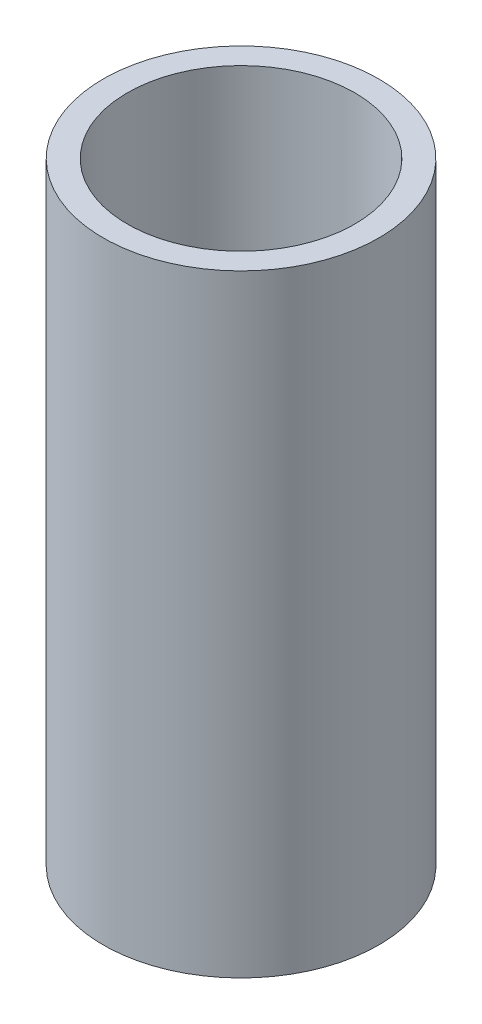
ISO-10303-21;
HEADER;
FILE_DESCRIPTION(('STEP AP214'),'2;1');
FILE_NAME('part.step','',(''),(''),'','','');
FILE_SCHEMA(('AUTOMOTIVE_DESIGN { 1 0 10303 214 1 1 1 1 }'));
ENDSEC;
DATA;
#1=APPLICATION_CONTEXT('core data for automotive mechanical design processes');
#2=APPLICATION_PROTOCOL_DEFINITION('international standard','automotive_design',2000,#1);
#3=PRODUCT_CONTEXT('',#1,'mechanical');
#4=PRODUCT('Part','Part','',(#3));
#5=PRODUCT_RELATED_PRODUCT_CATEGORY('part','',(#4));
#6=PRODUCT_DEFINITION_FORMATION('','',#4);
#7=PRODUCT_DEFINITION_CONTEXT('part definition',#1,'design');
#8=PRODUCT_DEFINITION('design','',#6,#7);
#9=PRODUCT_DEFINITION_SHAPE('','',#8);
#10=(LENGTH_UNIT() NAMED_UNIT(*) SI_UNIT(.MILLI.,.METRE.));
#11=(NAMED_UNIT(*) PLANE_ANGLE_UNIT() SI_UNIT($,.RADIAN.));
#12=(NAMED_UNIT(*) SI_UNIT($,.STERADIAN.) SOLID_ANGLE_UNIT());
#13=UNCERTAINTY_MEASURE_WITH_UNIT(LENGTH_MEASURE(1.E-05),#10,'distance_accuracy_value','');
#14=(GEOMETRIC_REPRESENTATION_CONTEXT(3) GLOBAL_UNCERTAINTY_ASSIGNED_CONTEXT((#13)) GLOBAL_UNIT_ASSIGNED_CONTEXT((#10,
#11,#12)) REPRESENTATION_CONTEXT('',''));
#15=CARTESIAN_POINT('',(0.,0.,0.));
#16=DIRECTION('',(0.,0.,1.));
#17=DIRECTION('',(1.,0.,0.));
#18=AXIS2_PLACEMENT_3D('',#15,#16,#17);
#19=CARTESIAN_POINT('',(0.,-2.28701204707182,0.));
#20=DIRECTION('',(0.,-1.,0.));
#21=DIRECTION('',(0.,0.,-1.));
#22=AXIS2_PLACEMENT_3D('',#19,#20,#21);
#23=CONICAL_SURFACE('',#22,17.02,1.48352986419518);
#24=CARTESIAN_POINT('',(0.,-1.62997218399213,0.));
#25=DIRECTION('',(0.,-1.,0.));
#26=DIRECTION('',(0.,0.,-1.));
#27=AXIS2_PLACEMENT_3D('',#24,#25,#26);
#28=CIRCLE('',#27,9.51);
#29=CARTESIAN_POINT('',(0.,-1.62997218399213,-9.51));
#30=VERTEX_POINT('',#29);
#31=EDGE_CURVE('E10',#30,#30,#28,.T.);
#32=ORIENTED_EDGE('',*,*,#31,.F.);
#33=EDGE_LOOP('',(#32));
#34=FACE_BOUND('',#33,.T.);
#35=CARTESIAN_POINT('',(0.,-2.28701204707182,0.));
#36=DIRECTION('',(0.,-1.,0.));
#37=DIRECTION('',(0.,0.,-1.));
#38=AXIS2_PLACEMENT_3D('',#35,#36,#37);
#39=CIRCLE('',#38,17.02);
#40=CARTESIAN_POINT('',(0.,-2.28701204707182,-17.02));
#41=VERTEX_POINT('',#40);
#42=EDGE_CURVE('E54',#41,#41,#39,.T.);
#43=ORIENTED_EDGE('',*,*,#42,.T.);
#44=EDGE_LOOP('',(#43));
#45=FACE_BOUND('',#44,.T.);
#46=ADVANCED_FACE('F32',(#34,#45),#23,.F.);
#47=CARTESIAN_POINT('',(-9.51,-1.62997218399213,0.));
#48=DIRECTION('',(0.,1.,0.));
#49=DIRECTION('',(0.,0.,1.));
#50=AXIS2_PLACEMENT_3D('',#47,#48,#49);
#51=PLANE('',#50);
#52=ORIENTED_EDGE('',*,*,#31,.T.);
#53=EDGE_LOOP('',(#52));
#54=FACE_BOUND('',#53,.T.);
#55=ADVANCED_FACE('F84',(#54),#51,.F.);
#56=CARTESIAN_POINT('',(-19.02,7.33002781600787,0.));
#57=DIRECTION('',(0.,-1.,0.));
#58=DIRECTION('',(0.,0.,-1.));
#59=AXIS2_PLACEMENT_3D('',#56,#57,#58);
#60=PLANE('',#59);
#61=CARTESIAN_POINT('',(0.,7.33002781600787,0.));
#62=DIRECTION('',(0.,-1.,0.));
#63=DIRECTION('',(0.,0.,-1.));
#64=AXIS2_PLACEMENT_3D('',#61,#62,#63);
#65=CIRCLE('',#64,19.02);
#66=CARTESIAN_POINT('',(0.,7.33002781600787,-19.02));
#67=VERTEX_POINT('',#66);
#68=EDGE_CURVE('E38',#67,#67,#65,.T.);
#69=ORIENTED_EDGE('',*,*,#68,.F.);
#70=EDGE_LOOP('',(#69));
#71=FACE_BOUND('',#70,.T.);
#72=ADVANCED_FACE('F79',(#71),#60,.F.);
#73=CARTESIAN_POINT('',(0.,0.,0.));
#74=DIRECTION('',(0.,-1.,0.));
#75=DIRECTION('',(0.,0.,-1.));
#76=AXIS2_PLACEMENT_3D('',#73,#74,#75);
#77=CYLINDRICAL_SURFACE('',#76,19.02);
#78=CARTESIAN_POINT('',(0.,100.112987952928,0.));
#79=DIRECTION('',(0.,-1.,0.));
#80=DIRECTION('',(0.,0.,-1.));
#81=AXIS2_PLACEMENT_3D('',#78,#79,#80);
#82=CIRCLE('',#81,19.02);
#83=CARTESIAN_POINT('',(0.,100.112987952928,-19.02));
#84=VERTEX_POINT('',#83);
#85=EDGE_CURVE('E42',#84,#84,#82,.T.);
#86=ORIENTED_EDGE('',*,*,#85,.F.);
#87=EDGE_LOOP('',(#86));
#88=FACE_BOUND('',#87,.T.);
#89=ORIENTED_EDGE('',*,*,#68,.T.);
#90=EDGE_LOOP('',(#89));
#91=FACE_BOUND('',#90,.T.);
#92=ADVANCED_FACE('F74',(#88,#91),#77,.F.);
#93=CARTESIAN_POINT('',(-23.04,100.112987952928,0.));
#94=DIRECTION('',(0.,-1.,0.));
#95=DIRECTION('',(0.,0.,-1.));
#96=AXIS2_PLACEMENT_3D('',#93,#94,#95);
#97=PLANE('',#96);
#98=CARTESIAN_POINT('',(0.,100.112987952928,0.));
#99=DIRECTION('',(0.,-1.,0.));
#100=DIRECTION('',(0.,0.,-1.));
#101=AXIS2_PLACEMENT_3D('',#98,#99,#100);
#102=CIRCLE('',#101,23.04);
#103=CARTESIAN_POINT('',(0.,100.112987952928,-23.04));
#104=VERTEX_POINT('',#103);
#105=EDGE_CURVE('E46',#104,#104,#102,.T.);
#106=ORIENTED_EDGE('',*,*,#105,.F.);
#107=EDGE_LOOP('',(#106));
#108=FACE_BOUND('',#107,.T.);
#109=ORIENTED_EDGE('',*,*,#85,.T.);
#110=EDGE_LOOP('',(#109));
#111=FACE_BOUND('',#110,.T.);
#112=ADVANCED_FACE('F68',(#108,#111),#97,.F.);
#113=CARTESIAN_POINT('',(0.,0.,0.));
#114=DIRECTION('',(0.,-1.,0.));
#115=DIRECTION('',(0.,0.,-1.));
#116=AXIS2_PLACEMENT_3D('',#113,#114,#115);
#117=CYLINDRICAL_SURFACE('',#116,23.04);
#118=CARTESIAN_POINT('',(0.,-2.28701204707182,0.));
#119=DIRECTION('',(0.,-1.,0.));
#120=DIRECTION('',(0.,0.,-1.));
#121=AXIS2_PLACEMENT_3D('',#118,#119,#120);
#122=CIRCLE('',#121,23.04);
#123=CARTESIAN_POINT('',(0.,-2.28701204707182,-23.04));
#124=VERTEX_POINT('',#123);
#125=EDGE_CURVE('E51',#124,#124,#122,.T.);
#126=ORIENTED_EDGE('',*,*,#125,.F.);
#127=EDGE_LOOP('',(#126));
#128=FACE_BOUND('',#127,.T.);
#129=ORIENTED_EDGE('',*,*,#105,.T.);
#130=EDGE_LOOP('',(#129));
#131=FACE_BOUND('',#130,.T.);
#132=ADVANCED_FACE('F62',(#128,#131),#117,.T.);
#133=CARTESIAN_POINT('',(-23.04,-2.28701204707182,0.));
#134=DIRECTION('',(0.,1.,0.));
#135=DIRECTION('',(0.,0.,1.));
#136=AXIS2_PLACEMENT_3D('',#133,#134,#135);
#137=PLANE('',#136);
#138=ORIENTED_EDGE('',*,*,#42,.F.);
#139=EDGE_LOOP('',(#138));
#140=FACE_BOUND('',#139,.T.);
#141=ORIENTED_EDGE('',*,*,#125,.T.);
#142=EDGE_LOOP('',(#141));
#143=FACE_BOUND('',#142,.T.);
#144=ADVANCED_FACE('F59',(#140,#143),#137,.F.);
#145=CLOSED_SHELL('',(#46,#55,#72,#92,#112,#132,#144));
#146=MANIFOLD_SOLID_BREP('B2',#145);
#147=ADVANCED_BREP_SHAPE_REPRESENTATION('',(#18,#146),#14);
#148=SHAPE_DEFINITION_REPRESENTATION(#9,#147);
ENDSEC;
END-ISO-10303-21;
